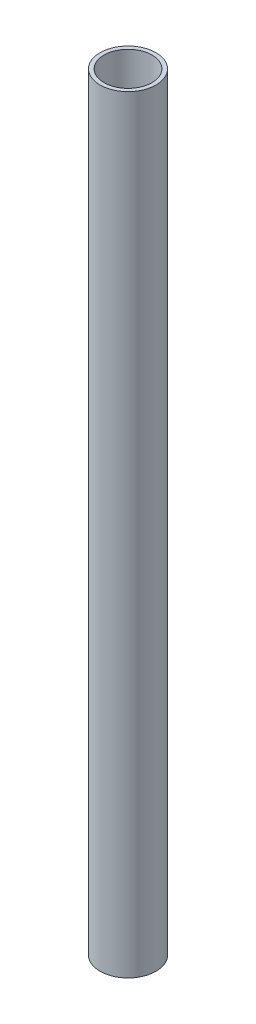
ISO-10303-21;
HEADER;
FILE_DESCRIPTION(('STEP AP214'),'2;1');
FILE_NAME('part.step','',(''),(''),'','','');
FILE_SCHEMA(('AUTOMOTIVE_DESIGN { 1 0 10303 214 1 1 1 1 }'));
ENDSEC;
DATA;
#1=APPLICATION_CONTEXT('core data for automotive mechanical design processes');
#2=APPLICATION_PROTOCOL_DEFINITION('international standard','automotive_design',2000,#1);
#3=PRODUCT_CONTEXT('',#1,'mechanical');
#4=PRODUCT('Part','Part','',(#3));
#5=PRODUCT_RELATED_PRODUCT_CATEGORY('part','',(#4));
#6=PRODUCT_DEFINITION_FORMATION('','',#4);
#7=PRODUCT_DEFINITION_CONTEXT('part definition',#1,'design');
#8=PRODUCT_DEFINITION('design','',#6,#7);
#9=PRODUCT_DEFINITION_SHAPE('','',#8);
#10=(LENGTH_UNIT() NAMED_UNIT(*) SI_UNIT(.MILLI.,.METRE.));
#11=(NAMED_UNIT(*) PLANE_ANGLE_UNIT() SI_UNIT($,.RADIAN.));
#12=(NAMED_UNIT(*) SI_UNIT($,.STERADIAN.) SOLID_ANGLE_UNIT());
#13=UNCERTAINTY_MEASURE_WITH_UNIT(LENGTH_MEASURE(1.E-05),#10,'distance_accuracy_value','');
#14=(GEOMETRIC_REPRESENTATION_CONTEXT(3) GLOBAL_UNCERTAINTY_ASSIGNED_CONTEXT((#13)) GLOBAL_UNIT_ASSIGNED_CONTEXT((#10,
#11,#12)) REPRESENTATION_CONTEXT('',''));
#15=CARTESIAN_POINT('',(0.,0.,0.));
#16=DIRECTION('',(0.,0.,1.));
#17=DIRECTION('',(1.,0.,0.));
#18=AXIS2_PLACEMENT_3D('',#15,#16,#17);
#19=CARTESIAN_POINT('',(0.,609.6,0.));
#20=DIRECTION('',(0.,1.,0.));
#21=DIRECTION('',(0.,0.,1.));
#22=AXIS2_PLACEMENT_3D('',#19,#20,#21);
#23=PLANE('',#22);
#24=CARTESIAN_POINT('',(0.,609.6,0.));
#25=DIRECTION('',(0.,1.,0.));
#26=DIRECTION('',(0.,0.,1.));
#27=AXIS2_PLACEMENT_3D('',#24,#25,#26);
#28=CIRCLE('',#27,44.45);
#29=CARTESIAN_POINT('',(0.,609.6,-44.45));
#30=VERTEX_POINT('',#29);
#31=EDGE_CURVE('E10',#30,#30,#28,.T.);
#32=ORIENTED_EDGE('',*,*,#31,.T.);
#33=EDGE_LOOP('',(#32));
#34=FACE_BOUND('',#33,.T.);
#35=CARTESIAN_POINT('',(0.,609.6,0.));
#36=DIRECTION('',(0.,1.,0.));
#37=DIRECTION('',(0.,0.,1.));
#38=AXIS2_PLACEMENT_3D('',#35,#36,#37);
#39=CIRCLE('',#38,38.1);
#40=CARTESIAN_POINT('',(0.,609.6,-38.1));
#41=VERTEX_POINT('',#40);
#42=EDGE_CURVE('E55',#41,#41,#39,.T.);
#43=ORIENTED_EDGE('',*,*,#42,.F.);
#44=EDGE_LOOP('',(#43));
#45=FACE_BOUND('',#44,.T.);
#46=ADVANCED_FACE('F43',(#34,#45),#23,.T.);
#47=CARTESIAN_POINT('',(0.,-609.6,0.));
#48=DIRECTION('',(0.,1.,0.));
#49=DIRECTION('',(0.,0.,1.));
#50=AXIS2_PLACEMENT_3D('',#47,#48,#49);
#51=PLANE('',#50);
#52=CARTESIAN_POINT('',(0.,-609.6,0.));
#53=DIRECTION('',(0.,1.,0.));
#54=DIRECTION('',(0.,0.,1.));
#55=AXIS2_PLACEMENT_3D('',#52,#53,#54);
#56=CIRCLE('',#55,44.45);
#57=CARTESIAN_POINT('',(0.,-609.6,-44.45));
#58=VERTEX_POINT('',#57);
#59=EDGE_CURVE('E47',#58,#58,#56,.T.);
#60=ORIENTED_EDGE('',*,*,#59,.F.);
#61=EDGE_LOOP('',(#60));
#62=FACE_BOUND('',#61,.T.);
#63=CARTESIAN_POINT('',(0.,-609.6,0.));
#64=DIRECTION('',(0.,1.,0.));
#65=DIRECTION('',(0.,0.,1.));
#66=AXIS2_PLACEMENT_3D('',#63,#64,#65);
#67=CIRCLE('',#66,38.1);
#68=CARTESIAN_POINT('',(0.,-609.6,-38.1));
#69=VERTEX_POINT('',#68);
#70=EDGE_CURVE('E57',#69,#69,#67,.T.);
#71=ORIENTED_EDGE('',*,*,#70,.T.);
#72=EDGE_LOOP('',(#71));
#73=FACE_BOUND('',#72,.T.);
#74=ADVANCED_FACE('F68',(#62,#73),#51,.F.);
#75=CARTESIAN_POINT('',(0.,609.6,0.));
#76=DIRECTION('',(0.,-1.,0.));
#77=DIRECTION('',(0.,0.,-1.));
#78=AXIS2_PLACEMENT_3D('',#75,#76,#77);
#79=CYLINDRICAL_SURFACE('',#78,44.45);
#80=CARTESIAN_POINT('',(0.,609.6,-44.45));
#81=CARTESIAN_POINT('',(0.,596.9,-44.45));
#82=CARTESIAN_POINT('',(0.,584.2,-44.45));
#83=CARTESIAN_POINT('',(0.,558.8,-44.45));
#84=CARTESIAN_POINT('',(0.,546.1,-44.45));
#85=CARTESIAN_POINT('',(0.,520.7,-44.45));
#86=CARTESIAN_POINT('',(0.,508.,-44.45));
#87=CARTESIAN_POINT('',(0.,482.6,-44.45));
#88=CARTESIAN_POINT('',(0.,469.9,-44.45));
#89=CARTESIAN_POINT('',(0.,444.5,-44.45));
#90=CARTESIAN_POINT('',(0.,431.8,-44.45));
#91=CARTESIAN_POINT('',(0.,406.4,-44.45));
#92=CARTESIAN_POINT('',(0.,393.7,-44.45));
#93=CARTESIAN_POINT('',(0.,368.3,-44.45));
#94=CARTESIAN_POINT('',(0.,355.6,-44.45));
#95=CARTESIAN_POINT('',(0.,330.2,-44.45));
#96=CARTESIAN_POINT('',(0.,317.5,-44.45));
#97=CARTESIAN_POINT('',(0.,292.1,-44.45));
#98=CARTESIAN_POINT('',(0.,279.4,-44.45));
#99=CARTESIAN_POINT('',(0.,254.,-44.45));
#100=CARTESIAN_POINT('',(0.,241.3,-44.45));
#101=CARTESIAN_POINT('',(0.,215.9,-44.45));
#102=CARTESIAN_POINT('',(0.,203.2,-44.45));
#103=CARTESIAN_POINT('',(0.,177.8,-44.45));
#104=CARTESIAN_POINT('',(0.,165.1,-44.45));
#105=CARTESIAN_POINT('',(0.,139.7,-44.45));
#106=CARTESIAN_POINT('',(0.,127.,-44.45));
#107=CARTESIAN_POINT('',(0.,101.6,-44.45));
#108=CARTESIAN_POINT('',(0.,88.8999999999999,-44.45));
#109=CARTESIAN_POINT('',(0.,63.4999999999999,-44.45));
#110=CARTESIAN_POINT('',(0.,50.7999999999999,-44.45));
#111=CARTESIAN_POINT('',(0.,25.3999999999999,-44.45));
#112=CARTESIAN_POINT('',(0.,12.6999999999999,-44.45));
#113=CARTESIAN_POINT('',(0.,-12.7000000000001,-44.45));
#114=CARTESIAN_POINT('',(0.,-25.4000000000001,-44.45));
#115=CARTESIAN_POINT('',(0.,-50.8000000000001,-44.45));
#116=CARTESIAN_POINT('',(0.,-63.5000000000002,-44.45));
#117=CARTESIAN_POINT('',(0.,-88.9000000000002,-44.45));
#118=CARTESIAN_POINT('',(0.,-101.6,-44.45));
#119=CARTESIAN_POINT('',(0.,-127.,-44.45));
#120=CARTESIAN_POINT('',(0.,-139.7,-44.45));
#121=CARTESIAN_POINT('',(0.,-165.1,-44.45));
#122=CARTESIAN_POINT('',(0.,-177.8,-44.45));
#123=CARTESIAN_POINT('',(0.,-203.2,-44.45));
#124=CARTESIAN_POINT('',(0.,-215.9,-44.45));
#125=CARTESIAN_POINT('',(0.,-241.3,-44.45));
#126=CARTESIAN_POINT('',(0.,-254.,-44.45));
#127=CARTESIAN_POINT('',(0.,-279.4,-44.45));
#128=CARTESIAN_POINT('',(0.,-292.1,-44.45));
#129=CARTESIAN_POINT('',(0.,-317.5,-44.45));
#130=CARTESIAN_POINT('',(0.,-330.2,-44.45));
#131=CARTESIAN_POINT('',(0.,-355.6,-44.45));
#132=CARTESIAN_POINT('',(0.,-368.3,-44.45));
#133=CARTESIAN_POINT('',(0.,-393.7,-44.45));
#134=CARTESIAN_POINT('',(0.,-406.4,-44.45));
#135=CARTESIAN_POINT('',(0.,-431.8,-44.45));
#136=CARTESIAN_POINT('',(0.,-444.5,-44.45));
#137=CARTESIAN_POINT('',(0.,-469.9,-44.45));
#138=CARTESIAN_POINT('',(0.,-482.6,-44.45));
#139=CARTESIAN_POINT('',(0.,-508.,-44.45));
#140=CARTESIAN_POINT('',(0.,-520.7,-44.45));
#141=CARTESIAN_POINT('',(0.,-546.1,-44.45));
#142=CARTESIAN_POINT('',(0.,-558.8,-44.45));
#143=CARTESIAN_POINT('',(0.,-584.2,-44.45));
#144=CARTESIAN_POINT('',(0.,-596.9,-44.45));
#145=CARTESIAN_POINT('',(0.,-609.6,-44.45));
#146=B_SPLINE_CURVE_WITH_KNOTS('',3,(#80,#81,#82,#83,#84,#85,#86,#87,#88,#89,#90,#91,#92,#93,
#94,#95,#96,#97,#98,#99,#100,#101,#102,#103,#104,#105,#106,#107,#108,#109,#110,#111,#112,#113,
#114,#115,#116,#117,#118,#119,#120,#121,#122,#123,#124,#125,#126,#127,#128,#129,#130,#131,#132,
#133,#134,#135,#136,#137,#138,#139,#140,#141,#142,#143,#144,#145),.UNSPECIFIED.,.F.,.F.,(4,2,2,
2,2,2,2,2,2,2,2,2,2,2,2,2,2,2,2,2,2,2,2,2,2,2,2,2,2,2,2,2,4),(0.,38.0999999999999,
76.1999999999999,114.3,152.4,190.5,228.6,266.7,304.8,342.9,381.,419.1,457.2,495.3,533.4,571.5,
609.6,647.7,685.8,723.9,762.,800.1,838.2,876.3,914.4,952.5,990.6,1028.7,1066.8,1104.9,1143.,
1181.1,1219.2),.UNSPECIFIED.);
#147=EDGE_CURVE('BSEAM45',#30,#58,#146,.T.);
#148=ORIENTED_EDGE('',*,*,#31,.F.);
#149=ORIENTED_EDGE('',*,*,#59,.T.);
#150=ORIENTED_EDGE('',*,*,#147,.T.);
#151=ORIENTED_EDGE('',*,*,#147,.F.);
#152=EDGE_LOOP('',(#148,#150,#149,#151));
#153=FACE_BOUND('',#152,.T.);
#154=ADVANCED_FACE('F45',(#153),#79,.T.);
#155=CARTESIAN_POINT('',(0.,609.6,0.));
#156=DIRECTION('',(0.,-1.,0.));
#157=DIRECTION('',(0.,0.,-1.));
#158=AXIS2_PLACEMENT_3D('',#155,#156,#157);
#159=CYLINDRICAL_SURFACE('',#158,38.1);
#160=CARTESIAN_POINT('',(0.,609.6,-38.1));
#161=CARTESIAN_POINT('',(0.,596.9,-38.1));
#162=CARTESIAN_POINT('',(0.,584.2,-38.1));
#163=CARTESIAN_POINT('',(0.,558.8,-38.1));
#164=CARTESIAN_POINT('',(0.,546.1,-38.1));
#165=CARTESIAN_POINT('',(0.,520.7,-38.1));
#166=CARTESIAN_POINT('',(0.,508.,-38.1));
#167=CARTESIAN_POINT('',(0.,482.6,-38.1));
#168=CARTESIAN_POINT('',(0.,469.9,-38.1));
#169=CARTESIAN_POINT('',(0.,444.5,-38.1));
#170=CARTESIAN_POINT('',(0.,431.8,-38.1));
#171=CARTESIAN_POINT('',(0.,406.4,-38.1));
#172=CARTESIAN_POINT('',(0.,393.7,-38.1));
#173=CARTESIAN_POINT('',(0.,368.3,-38.1));
#174=CARTESIAN_POINT('',(0.,355.6,-38.1));
#175=CARTESIAN_POINT('',(0.,330.2,-38.1));
#176=CARTESIAN_POINT('',(0.,317.5,-38.1));
#177=CARTESIAN_POINT('',(0.,292.1,-38.1));
#178=CARTESIAN_POINT('',(0.,279.4,-38.1));
#179=CARTESIAN_POINT('',(0.,254.,-38.1));
#180=CARTESIAN_POINT('',(0.,241.3,-38.1));
#181=CARTESIAN_POINT('',(0.,215.9,-38.1));
#182=CARTESIAN_POINT('',(0.,203.2,-38.1));
#183=CARTESIAN_POINT('',(0.,177.8,-38.1));
#184=CARTESIAN_POINT('',(0.,165.1,-38.1));
#185=CARTESIAN_POINT('',(0.,139.7,-38.1));
#186=CARTESIAN_POINT('',(0.,127.,-38.1));
#187=CARTESIAN_POINT('',(0.,101.6,-38.1));
#188=CARTESIAN_POINT('',(0.,88.8999999999999,-38.1));
#189=CARTESIAN_POINT('',(0.,63.4999999999999,-38.1));
#190=CARTESIAN_POINT('',(0.,50.7999999999999,-38.1));
#191=CARTESIAN_POINT('',(0.,25.3999999999999,-38.1));
#192=CARTESIAN_POINT('',(0.,12.6999999999999,-38.1));
#193=CARTESIAN_POINT('',(0.,-12.7000000000001,-38.1));
#194=CARTESIAN_POINT('',(0.,-25.4000000000001,-38.1));
#195=CARTESIAN_POINT('',(0.,-50.8000000000001,-38.1));
#196=CARTESIAN_POINT('',(0.,-63.5000000000002,-38.1));
#197=CARTESIAN_POINT('',(0.,-88.9000000000002,-38.1));
#198=CARTESIAN_POINT('',(0.,-101.6,-38.1));
#199=CARTESIAN_POINT('',(0.,-127.,-38.1));
#200=CARTESIAN_POINT('',(0.,-139.7,-38.1));
#201=CARTESIAN_POINT('',(0.,-165.1,-38.1));
#202=CARTESIAN_POINT('',(0.,-177.8,-38.1));
#203=CARTESIAN_POINT('',(0.,-203.2,-38.1));
#204=CARTESIAN_POINT('',(0.,-215.9,-38.1));
#205=CARTESIAN_POINT('',(0.,-241.3,-38.1));
#206=CARTESIAN_POINT('',(0.,-254.,-38.1));
#207=CARTESIAN_POINT('',(0.,-279.4,-38.1));
#208=CARTESIAN_POINT('',(0.,-292.1,-38.1));
#209=CARTESIAN_POINT('',(0.,-317.5,-38.1));
#210=CARTESIAN_POINT('',(0.,-330.2,-38.1));
#211=CARTESIAN_POINT('',(0.,-355.6,-38.1));
#212=CARTESIAN_POINT('',(0.,-368.3,-38.1));
#213=CARTESIAN_POINT('',(0.,-393.7,-38.1));
#214=CARTESIAN_POINT('',(0.,-406.4,-38.1));
#215=CARTESIAN_POINT('',(0.,-431.8,-38.1));
#216=CARTESIAN_POINT('',(0.,-444.5,-38.1));
#217=CARTESIAN_POINT('',(0.,-469.9,-38.1));
#218=CARTESIAN_POINT('',(0.,-482.6,-38.1));
#219=CARTESIAN_POINT('',(0.,-508.,-38.1));
#220=CARTESIAN_POINT('',(0.,-520.7,-38.1));
#221=CARTESIAN_POINT('',(0.,-546.1,-38.1));
#222=CARTESIAN_POINT('',(0.,-558.8,-38.1));
#223=CARTESIAN_POINT('',(0.,-584.2,-38.1));
#224=CARTESIAN_POINT('',(0.,-596.9,-38.1));
#225=CARTESIAN_POINT('',(0.,-609.6,-38.1));
#226=B_SPLINE_CURVE_WITH_KNOTS('',3,(#160,#161,#162,#163,#164,#165,#166,#167,#168,#169,#170,
#171,#172,#173,#174,#175,#176,#177,#178,#179,#180,#181,#182,#183,#184,#185,#186,#187,#188,#189,
#190,#191,#192,#193,#194,#195,#196,#197,#198,#199,#200,#201,#202,#203,#204,#205,#206,#207,#208,
#209,#210,#211,#212,#213,#214,#215,#216,#217,#218,#219,#220,#221,#222,#223,#224,#225),
.UNSPECIFIED.,.F.,.F.,(4,2,2,2,2,2,2,2,2,2,2,2,2,2,2,2,2,2,2,2,2,2,2,2,2,2,2,2,2,2,2,2,4),(0.,
38.0999999999999,76.1999999999999,114.3,152.4,190.5,228.6,266.7,304.8,342.9,381.,419.1,457.2,
495.3,533.4,571.5,609.6,647.7,685.8,723.9,762.,800.1,838.2,876.3,914.4,952.5,990.6,1028.7,
1066.8,1104.9,1143.,1181.1,1219.2),.UNSPECIFIED.);
#227=EDGE_CURVE('BSEAM64',#41,#69,#226,.T.);
#228=ORIENTED_EDGE('',*,*,#42,.T.);
#229=ORIENTED_EDGE('',*,*,#70,.F.);
#230=ORIENTED_EDGE('',*,*,#227,.T.);
#231=ORIENTED_EDGE('',*,*,#227,.F.);
#232=EDGE_LOOP('',(#228,#230,#229,#231));
#233=FACE_BOUND('',#232,.T.);
#234=ADVANCED_FACE('F64',(#233),#159,.F.);
#235=CLOSED_SHELL('',(#46,#74,#154,#234));
#236=MANIFOLD_SOLID_BREP('B2',#235);
#237=ADVANCED_BREP_SHAPE_REPRESENTATION('',(#18,#236),#14);
#238=SHAPE_DEFINITION_REPRESENTATION(#9,#237);
ENDSEC;
END-ISO-10303-21;
